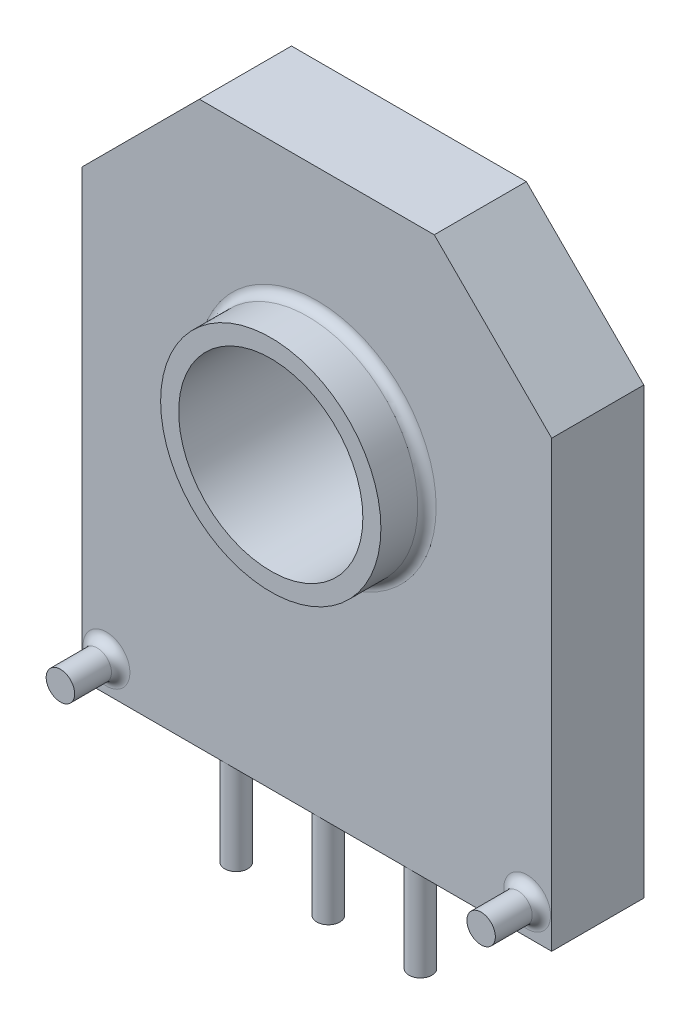
ISO-10303-21;
HEADER;
FILE_DESCRIPTION(('STEP AP214'),'2;1');
FILE_NAME('part.step','',(''),(''),'','','');
FILE_SCHEMA(('AUTOMOTIVE_DESIGN { 1 0 10303 214 1 1 1 1 }'));
ENDSEC;
DATA;
#1=APPLICATION_CONTEXT('core data for automotive mechanical design processes');
#2=APPLICATION_PROTOCOL_DEFINITION('international standard','automotive_design',2000,#1);
#3=PRODUCT_CONTEXT('',#1,'mechanical');
#4=PRODUCT('Part','Part','',(#3));
#5=PRODUCT_RELATED_PRODUCT_CATEGORY('part','',(#4));
#6=PRODUCT_DEFINITION_FORMATION('','',#4);
#7=PRODUCT_DEFINITION_CONTEXT('part definition',#1,'design');
#8=PRODUCT_DEFINITION('design','',#6,#7);
#9=PRODUCT_DEFINITION_SHAPE('','',#8);
#10=(LENGTH_UNIT() NAMED_UNIT(*) SI_UNIT(.MILLI.,.METRE.));
#11=(NAMED_UNIT(*) PLANE_ANGLE_UNIT() SI_UNIT($,.RADIAN.));
#12=(NAMED_UNIT(*) SI_UNIT($,.STERADIAN.) SOLID_ANGLE_UNIT());
#13=UNCERTAINTY_MEASURE_WITH_UNIT(LENGTH_MEASURE(1.E-05),#10,'distance_accuracy_value','');
#14=(GEOMETRIC_REPRESENTATION_CONTEXT(3) GLOBAL_UNCERTAINTY_ASSIGNED_CONTEXT((#13)) GLOBAL_UNIT_ASSIGNED_CONTEXT((#10,
#11,#12)) REPRESENTATION_CONTEXT('',''));
#15=CARTESIAN_POINT('',(0.,0.,0.));
#16=DIRECTION('',(0.,0.,1.));
#17=DIRECTION('',(1.,0.,0.));
#18=AXIS2_PLACEMENT_3D('',#15,#16,#17);
#19=CARTESIAN_POINT('',(0.,0.,2.));
#20=DIRECTION('',(0.,0.,1.));
#21=DIRECTION('',(1.,0.,0.));
#22=AXIS2_PLACEMENT_3D('',#19,#20,#21);
#23=PLANE('',#22);
#24=CARTESIAN_POINT('',(4.56778137063752,-6.43744793052759,2.));
#25=DIRECTION('',(0.,0.,1.));
#26=DIRECTION('',(1.,0.,0.));
#27=AXIS2_PLACEMENT_3D('',#24,#25,#26);
#28=CIRCLE('',#27,0.508853544633855);
#29=CARTESIAN_POINT('',(5.07663491527137,-6.43744793052759,2.));
#30=VERTEX_POINT('',#29);
#31=EDGE_CURVE('E168',#30,#30,#28,.F.);
#32=ORIENTED_EDGE('',*,*,#31,.T.);
#33=EDGE_LOOP('',(#32));
#34=FACE_BOUND('',#33,.T.);
#35=CARTESIAN_POINT('',(-4.56778137063752,-6.43744793052759,2.));
#36=DIRECTION('',(0.,0.,1.));
#37=DIRECTION('',(1.,0.,0.));
#38=AXIS2_PLACEMENT_3D('',#35,#36,#37);
#39=CIRCLE('',#38,0.508853544633855);
#40=CARTESIAN_POINT('',(-4.05892782600366,-6.43744793052759,2.));
#41=VERTEX_POINT('',#40);
#42=EDGE_CURVE('E165',#41,#41,#39,.F.);
#43=ORIENTED_EDGE('',*,*,#42,.T.);
#44=EDGE_LOOP('',(#43));
#45=FACE_BOUND('',#44,.T.);
#46=CARTESIAN_POINT('',(0.,0.,2.));
#47=DIRECTION('',(0.,0.,1.));
#48=DIRECTION('',(1.,0.,0.));
#49=AXIS2_PLACEMENT_3D('',#46,#47,#48);
#50=CIRCLE('',#49,2.59147336487381);
#51=CARTESIAN_POINT('',(2.59147336487381,0.,2.));
#52=VERTEX_POINT('',#51);
#53=EDGE_CURVE('E162',#52,#52,#50,.F.);
#54=ORIENTED_EDGE('',*,*,#53,.T.);
#55=EDGE_LOOP('',(#54));
#56=FACE_BOUND('',#55,.T.);
#57=DIRECTION('',(0.,1.,0.));
#58=VECTOR('',#57,1.);
#59=CARTESIAN_POINT('',(5.1,0.,2.));
#60=LINE('',#59,#58);
#61=CARTESIAN_POINT('',(5.10000000000001,-7.09999999999999,2.));
#62=VERTEX_POINT('',#61);
#63=CARTESIAN_POINT('',(5.10000000000004,2.55,2.));
#64=VERTEX_POINT('',#63);
#65=EDGE_CURVE('E96',#62,#64,#60,.T.);
#66=ORIENTED_EDGE('',*,*,#65,.T.);
#67=DIRECTION('',(-0.707106781186553,0.707106781186541,0.));
#68=VECTOR('',#67,1.);
#69=CARTESIAN_POINT('',(2.55,5.1,2.));
#70=LINE('',#69,#68);
#71=CARTESIAN_POINT('',(2.55,5.1,2.));
#72=VERTEX_POINT('',#71);
#73=EDGE_CURVE('E226',#64,#72,#70,.T.);
#74=ORIENTED_EDGE('',*,*,#73,.T.);
#75=DIRECTION('',(-1.,0.,0.));
#76=VECTOR('',#75,1.);
#77=CARTESIAN_POINT('',(2.55,5.1,2.));
#78=LINE('',#77,#76);
#79=CARTESIAN_POINT('',(-2.55,5.1,2.));
#80=VERTEX_POINT('',#79);
#81=EDGE_CURVE('E113',#72,#80,#78,.T.);
#82=ORIENTED_EDGE('',*,*,#81,.T.);
#83=DIRECTION('',(-0.707106781186541,-0.707106781186554,0.));
#84=VECTOR('',#83,1.);
#85=CARTESIAN_POINT('',(-2.55,5.1,2.));
#86=LINE('',#85,#84);
#87=CARTESIAN_POINT('',(-5.1,2.54999999999996,2.));
#88=VERTEX_POINT('',#87);
#89=EDGE_CURVE('E106',#80,#88,#86,.T.);
#90=ORIENTED_EDGE('',*,*,#89,.T.);
#91=DIRECTION('',(0.,-1.,0.));
#92=VECTOR('',#91,1.);
#93=CARTESIAN_POINT('',(-5.1,2.54999999999996,2.));
#94=LINE('',#93,#92);
#95=CARTESIAN_POINT('',(-5.1,-7.1,2.));
#96=VERTEX_POINT('',#95);
#97=EDGE_CURVE('E110',#88,#96,#94,.T.);
#98=ORIENTED_EDGE('',*,*,#97,.T.);
#99=DIRECTION('',(1.,0.,0.));
#100=VECTOR('',#99,1.);
#101=CARTESIAN_POINT('',(-5.1,-7.1,2.));
#102=LINE('',#101,#100);
#103=CARTESIAN_POINT('',(-2.,-7.1,1.99999999999997));
#104=VERTEX_POINT('',#103);
#105=EDGE_CURVE('E136',#96,#104,#102,.T.);
#106=ORIENTED_EDGE('',*,*,#105,.T.);
#107=CARTESIAN_POINT('',(0.,-7.1,2.));
#108=VERTEX_POINT('',#107);
#109=EDGE_CURVE('E134',#104,#108,#102,.T.);
#110=ORIENTED_EDGE('',*,*,#109,.T.);
#111=CARTESIAN_POINT('',(2.00000000000001,-7.1,2.00000000000003));
#112=VERTEX_POINT('',#111);
#113=EDGE_CURVE('E132',#108,#112,#102,.T.);
#114=ORIENTED_EDGE('',*,*,#113,.T.);
#115=EDGE_CURVE('E63',#112,#62,#102,.T.);
#116=ORIENTED_EDGE('',*,*,#115,.T.);
#117=EDGE_LOOP('',(#66,#74,#82,#90,#98,#106,#110,#114,#116));
#118=FACE_BOUND('',#117,.T.);
#119=ADVANCED_FACE('F46',(#34,#45,#56,#118),#23,.T.);
#120=CARTESIAN_POINT('',(0.,0.,0.));
#121=DIRECTION('',(0.,0.,1.));
#122=DIRECTION('',(1.,0.,0.));
#123=AXIS2_PLACEMENT_3D('',#120,#121,#122);
#124=PLANE('',#123);
#125=DIRECTION('',(0.,1.,0.));
#126=VECTOR('',#125,1.);
#127=CARTESIAN_POINT('',(5.10000000000004,2.55,0.));
#128=LINE('',#127,#126);
#129=CARTESIAN_POINT('',(5.10000000000001,-7.09999999999999,0.));
#130=VERTEX_POINT('',#129);
#131=CARTESIAN_POINT('',(5.10000000000004,2.55,0.));
#132=VERTEX_POINT('',#131);
#133=EDGE_CURVE('E91',#130,#132,#128,.T.);
#134=ORIENTED_EDGE('',*,*,#133,.F.);
#135=DIRECTION('',(1.,0.,0.));
#136=VECTOR('',#135,1.);
#137=CARTESIAN_POINT('',(0.,-7.1,0.));
#138=LINE('',#137,#136);
#139=CARTESIAN_POINT('',(-5.1,-7.1,0.));
#140=VERTEX_POINT('',#139);
#141=EDGE_CURVE('E87',#140,#130,#138,.T.);
#142=ORIENTED_EDGE('',*,*,#141,.F.);
#143=DIRECTION('',(0.,-1.,0.));
#144=VECTOR('',#143,1.);
#145=CARTESIAN_POINT('',(-5.1,0.,0.));
#146=LINE('',#145,#144);
#147=CARTESIAN_POINT('',(-5.1,2.54999999999996,0.));
#148=VERTEX_POINT('',#147);
#149=EDGE_CURVE('E146',#148,#140,#146,.T.);
#150=ORIENTED_EDGE('',*,*,#149,.F.);
#151=DIRECTION('',(-0.707106781186541,-0.707106781186554,0.));
#152=VECTOR('',#151,1.);
#153=CARTESIAN_POINT('',(-2.55,5.1,0.));
#154=LINE('',#153,#152);
#155=CARTESIAN_POINT('',(-2.55,5.1,0.));
#156=VERTEX_POINT('',#155);
#157=EDGE_CURVE('E123',#156,#148,#154,.T.);
#158=ORIENTED_EDGE('',*,*,#157,.F.);
#159=DIRECTION('',(-1.,0.,0.));
#160=VECTOR('',#159,1.);
#161=CARTESIAN_POINT('',(2.55,5.1,0.));
#162=LINE('',#161,#160);
#163=CARTESIAN_POINT('',(2.55,5.1,0.));
#164=VERTEX_POINT('',#163);
#165=EDGE_CURVE('E143',#164,#156,#162,.T.);
#166=ORIENTED_EDGE('',*,*,#165,.F.);
#167=DIRECTION('',(-0.707106781186553,0.707106781186541,0.));
#168=VECTOR('',#167,1.);
#169=CARTESIAN_POINT('',(2.55,5.1,0.));
#170=LINE('',#169,#168);
#171=EDGE_CURVE('E140',#132,#164,#170,.T.);
#172=ORIENTED_EDGE('',*,*,#171,.F.);
#173=EDGE_LOOP('',(#134,#142,#150,#158,#166,#172));
#174=FACE_BOUND('',#173,.T.);
#175=CARTESIAN_POINT('',(0.,0.,0.));
#176=DIRECTION('',(0.,0.,1.));
#177=DIRECTION('',(1.,0.,0.));
#178=AXIS2_PLACEMENT_3D('',#175,#176,#177);
#179=CIRCLE('',#178,2.);
#180=CARTESIAN_POINT('',(2.,0.,0.));
#181=VERTEX_POINT('',#180);
#182=EDGE_CURVE('E141',#181,#181,#179,.T.);
#183=ORIENTED_EDGE('',*,*,#182,.T.);
#184=EDGE_LOOP('',(#183));
#185=FACE_BOUND('',#184,.T.);
#186=ADVANCED_FACE('F191',(#174,#185),#124,.F.);
#187=CARTESIAN_POINT('',(5.10000000000004,2.55,2.));
#188=DIRECTION('',(-1.,0.,0.));
#189=DIRECTION('',(0.,-1.,0.));
#190=AXIS2_PLACEMENT_3D('',#187,#188,#189);
#191=PLANE('',#190);
#192=ORIENTED_EDGE('',*,*,#133,.T.);
#193=DIRECTION('',(0.,0.,-1.));
#194=VECTOR('',#193,1.);
#195=CARTESIAN_POINT('',(5.10000000000004,2.55,2.));
#196=LINE('',#195,#194);
#197=EDGE_CURVE('E156',#64,#132,#196,.T.);
#198=ORIENTED_EDGE('',*,*,#197,.F.);
#199=ORIENTED_EDGE('',*,*,#65,.F.);
#200=DIRECTION('',(0.,0.,-1.));
#201=VECTOR('',#200,1.);
#202=CARTESIAN_POINT('',(5.10000000000001,-7.09999999999999,2.));
#203=LINE('',#202,#201);
#204=EDGE_CURVE('E138',#62,#130,#203,.T.);
#205=ORIENTED_EDGE('',*,*,#204,.T.);
#206=EDGE_LOOP('',(#192,#198,#199,#205));
#207=FACE_BOUND('',#206,.T.);
#208=ADVANCED_FACE('F197',(#207),#191,.F.);
#209=CARTESIAN_POINT('',(2.55,5.1,2.));
#210=DIRECTION('',(-0.707106781186542,-0.707106781186554,0.));
#211=DIRECTION('',(0.707106781186554,-0.707106781186542,0.));
#212=AXIS2_PLACEMENT_3D('',#209,#210,#211);
#213=PLANE('',#212);
#214=ORIENTED_EDGE('',*,*,#171,.T.);
#215=DIRECTION('',(0.,0.,-1.));
#216=VECTOR('',#215,1.);
#217=CARTESIAN_POINT('',(2.55,5.1,2.));
#218=LINE('',#217,#216);
#219=EDGE_CURVE('E153',#72,#164,#218,.T.);
#220=ORIENTED_EDGE('',*,*,#219,.F.);
#221=ORIENTED_EDGE('',*,*,#73,.F.);
#222=ORIENTED_EDGE('',*,*,#197,.T.);
#223=EDGE_LOOP('',(#214,#220,#221,#222));
#224=FACE_BOUND('',#223,.T.);
#225=ADVANCED_FACE('F215',(#224),#213,.F.);
#226=CARTESIAN_POINT('',(2.55,5.1,2.));
#227=DIRECTION('',(0.,-1.,0.));
#228=DIRECTION('',(0.,0.,-1.));
#229=AXIS2_PLACEMENT_3D('',#226,#227,#228);
#230=PLANE('',#229);
#231=ORIENTED_EDGE('',*,*,#165,.T.);
#232=DIRECTION('',(0.,0.,-1.));
#233=VECTOR('',#232,1.);
#234=CARTESIAN_POINT('',(-2.55,5.1,2.));
#235=LINE('',#234,#233);
#236=EDGE_CURVE('E125',#80,#156,#235,.T.);
#237=ORIENTED_EDGE('',*,*,#236,.F.);
#238=ORIENTED_EDGE('',*,*,#81,.F.);
#239=ORIENTED_EDGE('',*,*,#219,.T.);
#240=EDGE_LOOP('',(#231,#237,#238,#239));
#241=FACE_BOUND('',#240,.T.);
#242=ADVANCED_FACE('F212',(#241),#230,.F.);
#243=CARTESIAN_POINT('',(-2.55,5.1,2.));
#244=DIRECTION('',(0.707106781186554,-0.707106781186541,0.));
#245=DIRECTION('',(0.707106781186541,0.707106781186554,0.));
#246=AXIS2_PLACEMENT_3D('',#243,#244,#245);
#247=PLANE('',#246);
#248=ORIENTED_EDGE('',*,*,#157,.T.);
#249=DIRECTION('',(0.,0.,-1.));
#250=VECTOR('',#249,1.);
#251=CARTESIAN_POINT('',(-5.1,2.54999999999996,2.));
#252=LINE('',#251,#250);
#253=EDGE_CURVE('E120',#88,#148,#252,.T.);
#254=ORIENTED_EDGE('',*,*,#253,.F.);
#255=ORIENTED_EDGE('',*,*,#89,.F.);
#256=ORIENTED_EDGE('',*,*,#236,.T.);
#257=EDGE_LOOP('',(#248,#254,#255,#256));
#258=FACE_BOUND('',#257,.T.);
#259=ADVANCED_FACE('F121',(#258),#247,.F.);
#260=CARTESIAN_POINT('',(-5.1,0.,2.));
#261=DIRECTION('',(1.,0.,0.));
#262=DIRECTION('',(0.,0.,-1.));
#263=AXIS2_PLACEMENT_3D('',#260,#261,#262);
#264=PLANE('',#263);
#265=ORIENTED_EDGE('',*,*,#149,.T.);
#266=DIRECTION('',(0.,0.,-1.));
#267=VECTOR('',#266,1.);
#268=CARTESIAN_POINT('',(-5.1,-7.1,2.));
#269=LINE('',#268,#267);
#270=EDGE_CURVE('E126',#96,#140,#269,.T.);
#271=ORIENTED_EDGE('',*,*,#270,.F.);
#272=ORIENTED_EDGE('',*,*,#97,.F.);
#273=ORIENTED_EDGE('',*,*,#253,.T.);
#274=EDGE_LOOP('',(#265,#271,#272,#273));
#275=FACE_BOUND('',#274,.T.);
#276=ADVANCED_FACE('F128',(#275),#264,.F.);
#277=CARTESIAN_POINT('',(0.,-7.1,2.));
#278=DIRECTION('',(0.,1.,0.));
#279=DIRECTION('',(-1.,0.,0.));
#280=AXIS2_PLACEMENT_3D('',#277,#278,#279);
#281=PLANE('',#280);
#282=ORIENTED_EDGE('',*,*,#109,.F.);
#283=CARTESIAN_POINT('',(-2.,-7.1,1.74999999999997));
#284=DIRECTION('',(0.,-1.,0.));
#285=DIRECTION('',(-1.,0.,0.));
#286=AXIS2_PLACEMENT_3D('',#283,#284,#285);
#287=CIRCLE('',#286,0.25);
#288=EDGE_CURVE('E259',#104,#104,#287,.T.);
#289=ORIENTED_EDGE('',*,*,#288,.F.);
#290=ORIENTED_EDGE('',*,*,#105,.F.);
#291=ORIENTED_EDGE('',*,*,#270,.T.);
#292=ORIENTED_EDGE('',*,*,#141,.T.);
#293=ORIENTED_EDGE('',*,*,#204,.F.);
#294=ORIENTED_EDGE('',*,*,#115,.F.);
#295=CARTESIAN_POINT('',(2.00000000000001,-7.1,1.75000000000003));
#296=DIRECTION('',(0.,-1.,0.));
#297=DIRECTION('',(1.,0.,0.));
#298=AXIS2_PLACEMENT_3D('',#295,#296,#297);
#299=CIRCLE('',#298,0.25);
#300=EDGE_CURVE('E253',#112,#112,#299,.T.);
#301=ORIENTED_EDGE('',*,*,#300,.F.);
#302=ORIENTED_EDGE('',*,*,#113,.F.);
#303=CARTESIAN_POINT('',(0.,-7.1,1.75));
#304=DIRECTION('',(0.,-1.,0.));
#305=DIRECTION('',(1.,0.,0.));
#306=AXIS2_PLACEMENT_3D('',#303,#304,#305);
#307=CIRCLE('',#306,0.25);
#308=EDGE_CURVE('E247',#108,#108,#307,.T.);
#309=ORIENTED_EDGE('',*,*,#308,.F.);
#310=EDGE_LOOP('',(#282,#289,#290,#291,#292,#293,#294,#301,#302,#309));
#311=FACE_BOUND('',#310,.T.);
#312=ADVANCED_FACE('F204',(#311),#281,.F.);
#313=CARTESIAN_POINT('',(0.,0.,2.));
#314=DIRECTION('',(0.,0.,-1.));
#315=DIRECTION('',(-1.,0.,0.));
#316=AXIS2_PLACEMENT_3D('',#313,#314,#315);
#317=CYLINDRICAL_SURFACE('',#316,2.);
#318=ORIENTED_EDGE('',*,*,#182,.F.);
#319=EDGE_LOOP('',(#318));
#320=FACE_BOUND('',#319,.T.);
#321=CARTESIAN_POINT('',(0.,0.,3.));
#322=DIRECTION('',(0.,0.,1.));
#323=DIRECTION('',(1.,0.,0.));
#324=AXIS2_PLACEMENT_3D('',#321,#322,#323);
#325=CIRCLE('',#324,2.);
#326=CARTESIAN_POINT('',(2.,0.,3.));
#327=VERTEX_POINT('',#326);
#328=EDGE_CURVE('E237',#327,#327,#325,.T.);
#329=ORIENTED_EDGE('',*,*,#328,.T.);
#330=EDGE_LOOP('',(#329));
#331=FACE_BOUND('',#330,.T.);
#332=ADVANCED_FACE('F201',(#320,#331),#317,.F.);
#333=CARTESIAN_POINT('',(0.,0.,3.));
#334=DIRECTION('',(0.,0.,1.));
#335=DIRECTION('',(1.,0.,0.));
#336=AXIS2_PLACEMENT_3D('',#333,#334,#335);
#337=PLANE('',#336);
#338=CARTESIAN_POINT('',(0.,0.,3.));
#339=DIRECTION('',(0.,0.,1.));
#340=DIRECTION('',(1.,0.,0.));
#341=AXIS2_PLACEMENT_3D('',#338,#339,#340);
#342=CIRCLE('',#341,2.39147336487381);
#343=CARTESIAN_POINT('',(2.39147336487381,0.,3.));
#344=VERTEX_POINT('',#343);
#345=EDGE_CURVE('E234',#344,#344,#342,.T.);
#346=ORIENTED_EDGE('',*,*,#345,.T.);
#347=EDGE_LOOP('',(#346));
#348=FACE_BOUND('',#347,.T.);
#349=ORIENTED_EDGE('',*,*,#328,.F.);
#350=EDGE_LOOP('',(#349));
#351=FACE_BOUND('',#350,.T.);
#352=ADVANCED_FACE('F314',(#348,#351),#337,.T.);
#353=CARTESIAN_POINT('',(0.,0.,3.));
#354=DIRECTION('',(0.,0.,-1.));
#355=DIRECTION('',(-1.,0.,0.));
#356=AXIS2_PLACEMENT_3D('',#353,#354,#355);
#357=CYLINDRICAL_SURFACE('',#356,2.39147336487381);
#358=CARTESIAN_POINT('',(0.,0.,2.2));
#359=DIRECTION('',(0.,0.,1.));
#360=DIRECTION('',(1.,0.,0.));
#361=AXIS2_PLACEMENT_3D('',#358,#359,#360);
#362=CIRCLE('',#361,2.39147336487381);
#363=CARTESIAN_POINT('',(2.39147336487381,0.,2.2));
#364=VERTEX_POINT('',#363);
#365=EDGE_CURVE('E13',#364,#364,#362,.T.);
#366=ORIENTED_EDGE('',*,*,#365,.T.);
#367=EDGE_LOOP('',(#366));
#368=FACE_BOUND('',#367,.T.);
#369=ORIENTED_EDGE('',*,*,#345,.F.);
#370=EDGE_LOOP('',(#369));
#371=FACE_BOUND('',#370,.T.);
#372=ADVANCED_FACE('F313',(#368,#371),#357,.T.);
#373=CARTESIAN_POINT('',(-4.56778137063752,-6.43744793052759,3.));
#374=DIRECTION('',(0.,0.,-1.));
#375=DIRECTION('',(-1.,0.,0.));
#376=AXIS2_PLACEMENT_3D('',#373,#374,#375);
#377=CYLINDRICAL_SURFACE('',#376,0.308853544633855);
#378=CARTESIAN_POINT('',(-4.56778137063752,-6.43744793052759,2.2));
#379=DIRECTION('',(0.,0.,1.));
#380=DIRECTION('',(1.,0.,0.));
#381=AXIS2_PLACEMENT_3D('',#378,#379,#380);
#382=CIRCLE('',#381,0.308853544633855);
#383=CARTESIAN_POINT('',(-4.25892782600366,-6.43744793052759,2.2));
#384=VERTEX_POINT('',#383);
#385=EDGE_CURVE('E55',#384,#384,#382,.T.);
#386=ORIENTED_EDGE('',*,*,#385,.T.);
#387=EDGE_LOOP('',(#386));
#388=FACE_BOUND('',#387,.T.);
#389=CARTESIAN_POINT('',(-4.56778137063752,-6.43744793052759,3.));
#390=DIRECTION('',(0.,0.,1.));
#391=DIRECTION('',(1.,0.,0.));
#392=AXIS2_PLACEMENT_3D('',#389,#390,#391);
#393=CIRCLE('',#392,0.308853544633855);
#394=CARTESIAN_POINT('',(-4.25892782600366,-6.43744793052759,3.));
#395=VERTEX_POINT('',#394);
#396=EDGE_CURVE('E240',#395,#395,#393,.T.);
#397=ORIENTED_EDGE('',*,*,#396,.F.);
#398=EDGE_LOOP('',(#397));
#399=FACE_BOUND('',#398,.T.);
#400=ADVANCED_FACE('F173',(#388,#399),#377,.T.);
#401=CARTESIAN_POINT('',(-4.56778137063752,-6.43744793052759,3.));
#402=DIRECTION('',(0.,0.,1.));
#403=DIRECTION('',(1.,0.,0.));
#404=AXIS2_PLACEMENT_3D('',#401,#402,#403);
#405=PLANE('',#404);
#406=ORIENTED_EDGE('',*,*,#396,.T.);
#407=EDGE_LOOP('',(#406));
#408=FACE_BOUND('',#407,.T.);
#409=ADVANCED_FACE('F306',(#408),#405,.T.);
#410=CARTESIAN_POINT('',(4.56778137063752,-6.43744793052759,3.));
#411=DIRECTION('',(0.,0.,-1.));
#412=DIRECTION('',(-1.,0.,0.));
#413=AXIS2_PLACEMENT_3D('',#410,#411,#412);
#414=CYLINDRICAL_SURFACE('',#413,0.308853544633855);
#415=CARTESIAN_POINT('',(4.56778137063752,-6.43744793052759,2.2));
#416=DIRECTION('',(0.,0.,1.));
#417=DIRECTION('',(1.,0.,0.));
#418=AXIS2_PLACEMENT_3D('',#415,#416,#417);
#419=CIRCLE('',#418,0.308853544633855);
#420=CARTESIAN_POINT('',(4.87663491527137,-6.43744793052759,2.2));
#421=VERTEX_POINT('',#420);
#422=EDGE_CURVE('E159',#421,#421,#419,.T.);
#423=ORIENTED_EDGE('',*,*,#422,.T.);
#424=EDGE_LOOP('',(#423));
#425=FACE_BOUND('',#424,.T.);
#426=CARTESIAN_POINT('',(4.56778137063752,-6.43744793052759,3.));
#427=DIRECTION('',(0.,0.,1.));
#428=DIRECTION('',(-1.,0.,0.));
#429=AXIS2_PLACEMENT_3D('',#426,#427,#428);
#430=CIRCLE('',#429,0.308853544633855);
#431=CARTESIAN_POINT('',(4.25892782600366,-6.43744793052759,3.));
#432=VERTEX_POINT('',#431);
#433=EDGE_CURVE('E243',#432,#432,#430,.T.);
#434=ORIENTED_EDGE('',*,*,#433,.F.);
#435=EDGE_LOOP('',(#434));
#436=FACE_BOUND('',#435,.T.);
#437=ADVANCED_FACE('F302',(#425,#436),#414,.T.);
#438=CARTESIAN_POINT('',(4.56778137063752,-6.43744793052759,3.));
#439=DIRECTION('',(0.,0.,-1.));
#440=DIRECTION('',(-1.,0.,0.));
#441=AXIS2_PLACEMENT_3D('',#438,#439,#440);
#442=PLANE('',#441);
#443=ORIENTED_EDGE('',*,*,#433,.T.);
#444=EDGE_LOOP('',(#443));
#445=FACE_BOUND('',#444,.T.);
#446=ADVANCED_FACE('F186',(#445),#442,.F.);
#447=CARTESIAN_POINT('',(4.56778137063752,-6.43744793052759,2.2));
#448=DIRECTION('',(0.,0.,1.));
#449=DIRECTION('',(1.,0.,0.));
#450=AXIS2_PLACEMENT_3D('',#447,#448,#449);
#451=TOROIDAL_SURFACE('',#450,0.508853544633855,0.2);
#452=ORIENTED_EDGE('',*,*,#31,.F.);
#453=EDGE_LOOP('',(#452));
#454=FACE_BOUND('',#453,.T.);
#455=ORIENTED_EDGE('',*,*,#422,.F.);
#456=EDGE_LOOP('',(#455));
#457=FACE_BOUND('',#456,.T.);
#458=ADVANCED_FACE('F178',(#454,#457),#451,.F.);
#459=CARTESIAN_POINT('',(-4.56778137063752,-6.43744793052759,2.2));
#460=DIRECTION('',(0.,0.,1.));
#461=DIRECTION('',(1.,0.,0.));
#462=AXIS2_PLACEMENT_3D('',#459,#460,#461);
#463=TOROIDAL_SURFACE('',#462,0.508853544633855,0.2);
#464=ORIENTED_EDGE('',*,*,#42,.F.);
#465=EDGE_LOOP('',(#464));
#466=FACE_BOUND('',#465,.T.);
#467=ORIENTED_EDGE('',*,*,#385,.F.);
#468=EDGE_LOOP('',(#467));
#469=FACE_BOUND('',#468,.T.);
#470=ADVANCED_FACE('F176',(#466,#469),#463,.F.);
#471=CARTESIAN_POINT('',(0.,0.,2.2));
#472=DIRECTION('',(0.,0.,1.));
#473=DIRECTION('',(1.,0.,0.));
#474=AXIS2_PLACEMENT_3D('',#471,#472,#473);
#475=TOROIDAL_SURFACE('',#474,2.59147336487381,0.2);
#476=ORIENTED_EDGE('',*,*,#53,.F.);
#477=EDGE_LOOP('',(#476));
#478=FACE_BOUND('',#477,.T.);
#479=ORIENTED_EDGE('',*,*,#365,.F.);
#480=EDGE_LOOP('',(#479));
#481=FACE_BOUND('',#480,.T.);
#482=ADVANCED_FACE('F48',(#478,#481),#475,.F.);
#483=CARTESIAN_POINT('',(0.,-9.1,1.75));
#484=DIRECTION('',(0.,1.,0.));
#485=DIRECTION('',(-1.,0.,0.));
#486=AXIS2_PLACEMENT_3D('',#483,#484,#485);
#487=CYLINDRICAL_SURFACE('',#486,0.25);
#488=CARTESIAN_POINT('',(0.,-9.1,1.75));
#489=DIRECTION('',(0.,-1.,0.));
#490=DIRECTION('',(1.,0.,0.));
#491=AXIS2_PLACEMENT_3D('',#488,#489,#490);
#492=CIRCLE('',#491,0.25);
#493=CARTESIAN_POINT('',(0.250000000000012,-9.1,1.75));
#494=VERTEX_POINT('',#493);
#495=EDGE_CURVE('E246',#494,#494,#492,.T.);
#496=ORIENTED_EDGE('',*,*,#495,.F.);
#497=EDGE_LOOP('',(#496));
#498=FACE_BOUND('',#497,.T.);
#499=ORIENTED_EDGE('',*,*,#308,.T.);
#500=EDGE_LOOP('',(#499));
#501=FACE_BOUND('',#500,.T.);
#502=ADVANCED_FACE('F184',(#498,#501),#487,.T.);
#503=CARTESIAN_POINT('',(0.,-9.1,1.75));
#504=DIRECTION('',(0.,-1.,0.));
#505=DIRECTION('',(1.,0.,0.));
#506=AXIS2_PLACEMENT_3D('',#503,#504,#505);
#507=PLANE('',#506);
#508=ORIENTED_EDGE('',*,*,#495,.T.);
#509=EDGE_LOOP('',(#508));
#510=FACE_BOUND('',#509,.T.);
#511=ADVANCED_FACE('F284',(#510),#507,.T.);
#512=CARTESIAN_POINT('',(2.00000000000001,-9.1,1.75000000000003));
#513=DIRECTION('',(0.,1.,0.));
#514=DIRECTION('',(-1.,0.,0.));
#515=AXIS2_PLACEMENT_3D('',#512,#513,#514);
#516=CYLINDRICAL_SURFACE('',#515,0.25);
#517=CARTESIAN_POINT('',(2.00000000000001,-9.1,1.75000000000003));
#518=DIRECTION('',(0.,-1.,0.));
#519=DIRECTION('',(1.,0.,0.));
#520=AXIS2_PLACEMENT_3D('',#517,#518,#519);
#521=CIRCLE('',#520,0.25);
#522=CARTESIAN_POINT('',(2.25000000000001,-9.1,1.75000000000003));
#523=VERTEX_POINT('',#522);
#524=EDGE_CURVE('E250',#523,#523,#521,.T.);
#525=ORIENTED_EDGE('',*,*,#524,.F.);
#526=EDGE_LOOP('',(#525));
#527=FACE_BOUND('',#526,.T.);
#528=ORIENTED_EDGE('',*,*,#300,.T.);
#529=EDGE_LOOP('',(#528));
#530=FACE_BOUND('',#529,.T.);
#531=ADVANCED_FACE('F282',(#527,#530),#516,.T.);
#532=CARTESIAN_POINT('',(2.00000000000001,-9.1,1.75000000000003));
#533=DIRECTION('',(0.,-1.,0.));
#534=DIRECTION('',(1.,0.,0.));
#535=AXIS2_PLACEMENT_3D('',#532,#533,#534);
#536=PLANE('',#535);
#537=ORIENTED_EDGE('',*,*,#524,.T.);
#538=EDGE_LOOP('',(#537));
#539=FACE_BOUND('',#538,.T.);
#540=ADVANCED_FACE('F270',(#539),#536,.T.);
#541=CARTESIAN_POINT('',(-2.,-9.1,1.74999999999997));
#542=DIRECTION('',(0.,1.,0.));
#543=DIRECTION('',(-1.,0.,0.));
#544=AXIS2_PLACEMENT_3D('',#541,#542,#543);
#545=CYLINDRICAL_SURFACE('',#544,0.25);
#546=CARTESIAN_POINT('',(-2.,-9.1,1.74999999999997));
#547=DIRECTION('',(0.,-1.,0.));
#548=DIRECTION('',(-1.,0.,0.));
#549=AXIS2_PLACEMENT_3D('',#546,#547,#548);
#550=CIRCLE('',#549,0.25);
#551=CARTESIAN_POINT('',(-2.25,-9.1,1.74999999999997));
#552=VERTEX_POINT('',#551);
#553=EDGE_CURVE('E256',#552,#552,#550,.T.);
#554=ORIENTED_EDGE('',*,*,#553,.F.);
#555=EDGE_LOOP('',(#554));
#556=FACE_BOUND('',#555,.T.);
#557=ORIENTED_EDGE('',*,*,#288,.T.);
#558=EDGE_LOOP('',(#557));
#559=FACE_BOUND('',#558,.T.);
#560=ADVANCED_FACE('F267',(#556,#559),#545,.T.);
#561=CARTESIAN_POINT('',(-2.,-9.1,1.74999999999997));
#562=DIRECTION('',(0.,1.,0.));
#563=DIRECTION('',(-1.,0.,0.));
#564=AXIS2_PLACEMENT_3D('',#561,#562,#563);
#565=PLANE('',#564);
#566=ORIENTED_EDGE('',*,*,#553,.T.);
#567=EDGE_LOOP('',(#566));
#568=FACE_BOUND('',#567,.T.);
#569=ADVANCED_FACE('F265',(#568),#565,.F.);
#570=CLOSED_SHELL('',(#119,#186,#208,#225,#242,#259,#276,#312,#332,#352,#372,#400,#409,#437,
#446,#458,#470,#482,#502,#511,#531,#540,#560,#569));
#571=MANIFOLD_SOLID_BREP('B2',#570);
#572=ADVANCED_BREP_SHAPE_REPRESENTATION('',(#18,#571),#14);
#573=SHAPE_DEFINITION_REPRESENTATION(#9,#572);
ENDSEC;
END-ISO-10303-21;
